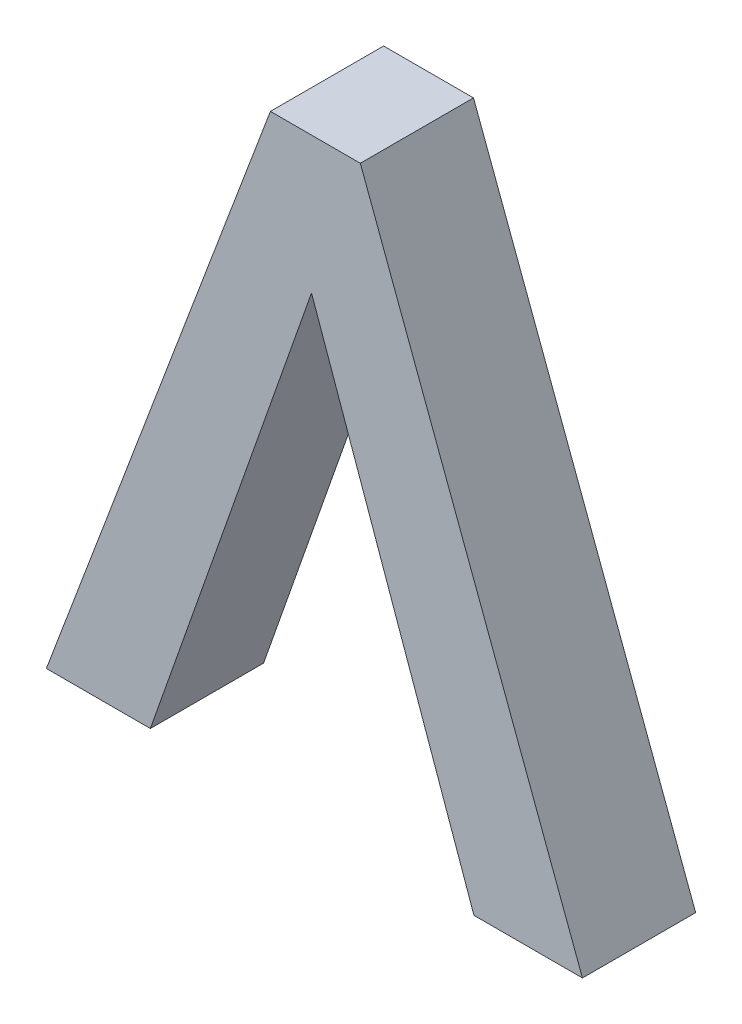
ISO-10303-21;
HEADER;
FILE_DESCRIPTION(('STEP AP214'),'2;1');
FILE_NAME('part.step','',(''),(''),'','','');
FILE_SCHEMA(('AUTOMOTIVE_DESIGN { 1 0 10303 214 1 1 1 1 }'));
ENDSEC;
DATA;
#1=APPLICATION_CONTEXT('core data for automotive mechanical design processes');
#2=APPLICATION_PROTOCOL_DEFINITION('international standard','automotive_design',2000,#1);
#3=PRODUCT_CONTEXT('',#1,'mechanical');
#4=PRODUCT('Part','Part','',(#3));
#5=PRODUCT_RELATED_PRODUCT_CATEGORY('part','',(#4));
#6=PRODUCT_DEFINITION_FORMATION('','',#4);
#7=PRODUCT_DEFINITION_CONTEXT('part definition',#1,'design');
#8=PRODUCT_DEFINITION('design','',#6,#7);
#9=PRODUCT_DEFINITION_SHAPE('','',#8);
#10=(LENGTH_UNIT() NAMED_UNIT(*) SI_UNIT(.MILLI.,.METRE.));
#11=(NAMED_UNIT(*) PLANE_ANGLE_UNIT() SI_UNIT($,.RADIAN.));
#12=(NAMED_UNIT(*) SI_UNIT($,.STERADIAN.) SOLID_ANGLE_UNIT());
#13=UNCERTAINTY_MEASURE_WITH_UNIT(LENGTH_MEASURE(1.E-05),#10,'distance_accuracy_value','');
#14=(GEOMETRIC_REPRESENTATION_CONTEXT(3) GLOBAL_UNCERTAINTY_ASSIGNED_CONTEXT((#13)) GLOBAL_UNIT_ASSIGNED_CONTEXT((#10,
#11,#12)) REPRESENTATION_CONTEXT('',''));
#15=CARTESIAN_POINT('',(0.,0.,0.));
#16=DIRECTION('',(0.,0.,1.));
#17=DIRECTION('',(1.,0.,0.));
#18=AXIS2_PLACEMENT_3D('',#15,#16,#17);
#19=CARTESIAN_POINT('',(-2.58061998201,1.28436413185,0.));
#20=DIRECTION('',(0.,1.,0.));
#21=DIRECTION('',(-1.,0.,0.));
#22=AXIS2_PLACEMENT_3D('',#19,#20,#21);
#23=PLANE('',#22);
#24=DIRECTION('',(1.,0.,0.));
#25=VECTOR('',#24,1.);
#26=CARTESIAN_POINT('',(-2.660018365691,1.28436413185,0.));
#27=LINE('',#26,#25);
#28=CARTESIAN_POINT('',(-2.660018365691,1.28436413185,0.));
#29=VERTEX_POINT('',#28);
#30=CARTESIAN_POINT('',(-2.58061998201,1.28436413185,0.));
#31=VERTEX_POINT('',#30);
#32=EDGE_CURVE('E11',#29,#31,#27,.T.);
#33=ORIENTED_EDGE('',*,*,#32,.F.);
#34=DIRECTION('',(0.,0.,1.));
#35=VECTOR('',#34,1.);
#36=CARTESIAN_POINT('',(-2.660018365691,1.28436413185,0.));
#37=LINE('',#36,#35);
#38=CARTESIAN_POINT('',(-2.660018365691,1.28436413185,0.1));
#39=VERTEX_POINT('',#38);
#40=EDGE_CURVE('E24',#29,#39,#37,.T.);
#41=ORIENTED_EDGE('',*,*,#40,.T.);
#42=DIRECTION('',(-1.,0.,0.));
#43=VECTOR('',#42,1.);
#44=CARTESIAN_POINT('',(-2.660018365691,1.28436413185,0.1));
#45=LINE('',#44,#43);
#46=CARTESIAN_POINT('',(-2.58061998201,1.28436413185,0.1));
#47=VERTEX_POINT('',#46);
#48=EDGE_CURVE('E94',#47,#39,#45,.T.);
#49=ORIENTED_EDGE('',*,*,#48,.F.);
#50=DIRECTION('',(0.,0.,1.));
#51=VECTOR('',#50,1.);
#52=CARTESIAN_POINT('',(-2.58061998201,1.28436413185,0.));
#53=LINE('',#52,#51);
#54=EDGE_CURVE('E127',#31,#47,#53,.T.);
#55=ORIENTED_EDGE('',*,*,#54,.F.);
#56=EDGE_LOOP('',(#33,#41,#49,#55));
#57=FACE_BOUND('',#56,.T.);
#58=ADVANCED_FACE('F17',(#57),#23,.T.);
#59=CARTESIAN_POINT('',(-2.384392548057,0.759200536932928,0.));
#60=DIRECTION('',(0.936744248481591,0.350014589605433,0.));
#61=DIRECTION('',(-0.350014589605433,0.936744248481591,0.));
#62=AXIS2_PLACEMENT_3D('',#59,#60,#61);
#63=PLANE('',#62);
#64=DIRECTION('',(0.350014589605433,-0.936744248481591,0.));
#65=VECTOR('',#64,1.);
#66=CARTESIAN_POINT('',(-2.58061998201,1.28436413185,0.));
#67=LINE('',#66,#65);
#68=CARTESIAN_POINT('',(-2.384392548057,0.759200536932928,0.));
#69=VERTEX_POINT('',#68);
#70=EDGE_CURVE('E125',#31,#69,#67,.T.);
#71=ORIENTED_EDGE('',*,*,#70,.F.);
#72=ORIENTED_EDGE('',*,*,#54,.T.);
#73=DIRECTION('',(-0.350014589605433,0.936744248481591,0.));
#74=VECTOR('',#73,1.);
#75=CARTESIAN_POINT('',(-2.58061998201,1.28436413185,0.1));
#76=LINE('',#75,#74);
#77=CARTESIAN_POINT('',(-2.384392548057,0.759200536932928,0.1));
#78=VERTEX_POINT('',#77);
#79=EDGE_CURVE('E123',#78,#47,#76,.T.);
#80=ORIENTED_EDGE('',*,*,#79,.F.);
#81=DIRECTION('',(0.,0.,1.));
#82=VECTOR('',#81,1.);
#83=CARTESIAN_POINT('',(-2.384392548057,0.759200536932928,0.));
#84=LINE('',#83,#82);
#85=EDGE_CURVE('E120',#69,#78,#84,.T.);
#86=ORIENTED_EDGE('',*,*,#85,.F.);
#87=EDGE_LOOP('',(#71,#72,#80,#86));
#88=FACE_BOUND('',#87,.T.);
#89=ADVANCED_FACE('F145',(#88),#63,.T.);
#90=CARTESIAN_POINT('',(-2.480237739785,0.759200536932928,0.));
#91=DIRECTION('',(0.,-1.,0.));
#92=DIRECTION('',(1.,0.,0.));
#93=AXIS2_PLACEMENT_3D('',#90,#91,#92);
#94=PLANE('',#93);
#95=DIRECTION('',(-1.,0.,0.));
#96=VECTOR('',#95,1.);
#97=CARTESIAN_POINT('',(-2.384392548057,0.759200536932928,0.));
#98=LINE('',#97,#96);
#99=CARTESIAN_POINT('',(-2.480237739785,0.759200536932928,0.));
#100=VERTEX_POINT('',#99);
#101=EDGE_CURVE('E118',#69,#100,#98,.T.);
#102=ORIENTED_EDGE('',*,*,#101,.F.);
#103=ORIENTED_EDGE('',*,*,#85,.T.);
#104=DIRECTION('',(1.,0.,0.));
#105=VECTOR('',#104,1.);
#106=CARTESIAN_POINT('',(-2.384392548057,0.759200536932928,0.1));
#107=LINE('',#106,#105);
#108=CARTESIAN_POINT('',(-2.480237739785,0.759200536932928,0.1));
#109=VERTEX_POINT('',#108);
#110=EDGE_CURVE('E115',#109,#78,#107,.T.);
#111=ORIENTED_EDGE('',*,*,#110,.F.);
#112=DIRECTION('',(0.,0.,1.));
#113=VECTOR('',#112,1.);
#114=CARTESIAN_POINT('',(-2.480237739785,0.759200536932928,0.));
#115=LINE('',#114,#113);
#116=EDGE_CURVE('E112',#100,#109,#115,.T.);
#117=ORIENTED_EDGE('',*,*,#116,.F.);
#118=EDGE_LOOP('',(#102,#103,#111,#117));
#119=FACE_BOUND('',#118,.T.);
#120=ADVANCED_FACE('F141',(#119),#94,.T.);
#121=CARTESIAN_POINT('',(-2.623721961723,1.163565162393,0.));
#122=DIRECTION('',(-0.942427745481246,-0.334409845170765,0.));
#123=DIRECTION('',(0.334409845170765,-0.942427745481246,0.));
#124=AXIS2_PLACEMENT_3D('',#121,#122,#123);
#125=PLANE('',#124);
#126=DIRECTION('',(-0.334409845170765,0.942427745481246,0.));
#127=VECTOR('',#126,1.);
#128=CARTESIAN_POINT('',(-2.480237739785,0.759200536932928,0.));
#129=LINE('',#128,#127);
#130=CARTESIAN_POINT('',(-2.623721961723,1.163565162393,0.));
#131=VERTEX_POINT('',#130);
#132=EDGE_CURVE('E110',#100,#131,#129,.T.);
#133=ORIENTED_EDGE('',*,*,#132,.F.);
#134=ORIENTED_EDGE('',*,*,#116,.T.);
#135=DIRECTION('',(0.334409845170765,-0.942427745481246,0.));
#136=VECTOR('',#135,1.);
#137=CARTESIAN_POINT('',(-2.480237739785,0.759200536932928,0.1));
#138=LINE('',#137,#136);
#139=CARTESIAN_POINT('',(-2.623721961723,1.163565162393,0.1));
#140=VERTEX_POINT('',#139);
#141=EDGE_CURVE('E107',#140,#109,#138,.T.);
#142=ORIENTED_EDGE('',*,*,#141,.F.);
#143=DIRECTION('',(0.,0.,1.));
#144=VECTOR('',#143,1.);
#145=CARTESIAN_POINT('',(-2.623721961723,1.163565162393,0.));
#146=LINE('',#145,#144);
#147=EDGE_CURVE('E104',#131,#140,#146,.T.);
#148=ORIENTED_EDGE('',*,*,#147,.F.);
#149=EDGE_LOOP('',(#133,#134,#142,#148));
#150=FACE_BOUND('',#149,.T.);
#151=ADVANCED_FACE('F137',(#150),#125,.T.);
#152=CARTESIAN_POINT('',(-2.766071921036,0.759200536932928,0.));
#153=DIRECTION('',(0.943258685640994,-0.332058807988623,0.));
#154=DIRECTION('',(0.332058807988623,0.943258685640994,0.));
#155=AXIS2_PLACEMENT_3D('',#152,#153,#154);
#156=PLANE('',#155);
#157=DIRECTION('',(-0.332058807988623,-0.943258685640994,0.));
#158=VECTOR('',#157,1.);
#159=CARTESIAN_POINT('',(-2.623721961723,1.163565162393,0.));
#160=LINE('',#159,#158);
#161=CARTESIAN_POINT('',(-2.766071921036,0.759200536932928,0.));
#162=VERTEX_POINT('',#161);
#163=EDGE_CURVE('E102',#131,#162,#160,.T.);
#164=ORIENTED_EDGE('',*,*,#163,.F.);
#165=ORIENTED_EDGE('',*,*,#147,.T.);
#166=DIRECTION('',(0.332058807988623,0.943258685640994,0.));
#167=VECTOR('',#166,1.);
#168=CARTESIAN_POINT('',(-2.623721961723,1.163565162393,0.1));
#169=LINE('',#168,#167);
#170=CARTESIAN_POINT('',(-2.766071921036,0.759200536932928,0.1));
#171=VERTEX_POINT('',#170);
#172=EDGE_CURVE('E100',#171,#140,#169,.T.);
#173=ORIENTED_EDGE('',*,*,#172,.F.);
#174=DIRECTION('',(0.,0.,1.));
#175=VECTOR('',#174,1.);
#176=CARTESIAN_POINT('',(-2.766071921036,0.759200536932928,0.));
#177=LINE('',#176,#175);
#178=EDGE_CURVE('E79',#162,#171,#177,.T.);
#179=ORIENTED_EDGE('',*,*,#178,.F.);
#180=EDGE_LOOP('',(#164,#165,#173,#179));
#181=FACE_BOUND('',#180,.T.);
#182=ADVANCED_FACE('F135',(#181),#156,.T.);
#183=CARTESIAN_POINT('',(-2.857947193581,0.759200536932928,0.));
#184=DIRECTION('',(0.,-1.,0.));
#185=DIRECTION('',(1.,0.,0.));
#186=AXIS2_PLACEMENT_3D('',#183,#184,#185);
#187=PLANE('',#186);
#188=DIRECTION('',(-1.,0.,0.));
#189=VECTOR('',#188,1.);
#190=CARTESIAN_POINT('',(-2.766071921036,0.759200536932928,0.));
#191=LINE('',#190,#189);
#192=CARTESIAN_POINT('',(-2.857947193581,0.759200536932928,0.));
#193=VERTEX_POINT('',#192);
#194=EDGE_CURVE('E83',#162,#193,#191,.T.);
#195=ORIENTED_EDGE('',*,*,#194,.F.);
#196=ORIENTED_EDGE('',*,*,#178,.T.);
#197=DIRECTION('',(1.,0.,0.));
#198=VECTOR('',#197,1.);
#199=CARTESIAN_POINT('',(-2.766071921036,0.759200536932928,0.1));
#200=LINE('',#199,#198);
#201=CARTESIAN_POINT('',(-2.857947193581,0.759200536932928,0.1));
#202=VERTEX_POINT('',#201);
#203=EDGE_CURVE('E72',#202,#171,#200,.T.);
#204=ORIENTED_EDGE('',*,*,#203,.F.);
#205=DIRECTION('',(0.,0.,1.));
#206=VECTOR('',#205,1.);
#207=CARTESIAN_POINT('',(-2.857947193581,0.759200536932928,0.));
#208=LINE('',#207,#206);
#209=EDGE_CURVE('E76',#193,#202,#208,.T.);
#210=ORIENTED_EDGE('',*,*,#209,.F.);
#211=EDGE_LOOP('',(#195,#196,#204,#210));
#212=FACE_BOUND('',#211,.T.);
#213=ADVANCED_FACE('F75',(#212),#187,.T.);
#214=CARTESIAN_POINT('',(-2.660018365691,1.28436413185,0.));
#215=DIRECTION('',(-0.935746495818411,0.35267335533545,0.));
#216=DIRECTION('',(-0.35267335533545,-0.935746495818411,0.));
#217=AXIS2_PLACEMENT_3D('',#214,#215,#216);
#218=PLANE('',#217);
#219=DIRECTION('',(0.35267335533545,0.935746495818411,0.));
#220=VECTOR('',#219,1.);
#221=CARTESIAN_POINT('',(-2.857947193581,0.759200536932928,0.));
#222=LINE('',#221,#220);
#223=EDGE_CURVE('E89',#193,#29,#222,.T.);
#224=ORIENTED_EDGE('',*,*,#223,.F.);
#225=ORIENTED_EDGE('',*,*,#209,.T.);
#226=DIRECTION('',(-0.35267335533545,-0.935746495818411,0.));
#227=VECTOR('',#226,1.);
#228=CARTESIAN_POINT('',(-2.857947193581,0.759200536932928,0.1));
#229=LINE('',#228,#227);
#230=EDGE_CURVE('E88',#39,#202,#229,.T.);
#231=ORIENTED_EDGE('',*,*,#230,.F.);
#232=ORIENTED_EDGE('',*,*,#40,.F.);
#233=EDGE_LOOP('',(#224,#225,#231,#232));
#234=FACE_BOUND('',#233,.T.);
#235=ADVANCED_FACE('F87',(#234),#218,.T.);
#236=CARTESIAN_POINT('',(-2.621565725245,0.986063050332372,0.));
#237=DIRECTION('',(0.,0.,1.));
#238=DIRECTION('',(1.,0.,0.));
#239=AXIS2_PLACEMENT_3D('',#236,#237,#238);
#240=PLANE('',#239);
#241=ORIENTED_EDGE('',*,*,#223,.T.);
#242=ORIENTED_EDGE('',*,*,#32,.T.);
#243=ORIENTED_EDGE('',*,*,#70,.T.);
#244=ORIENTED_EDGE('',*,*,#101,.T.);
#245=ORIENTED_EDGE('',*,*,#132,.T.);
#246=ORIENTED_EDGE('',*,*,#163,.T.);
#247=ORIENTED_EDGE('',*,*,#194,.T.);
#248=EDGE_LOOP('',(#241,#242,#243,#244,#245,#246,#247));
#249=FACE_BOUND('',#248,.T.);
#250=ADVANCED_FACE('F130',(#249),#240,.F.);
#251=CARTESIAN_POINT('',(-2.621565725245,0.986063050332372,0.1));
#252=DIRECTION('',(0.,0.,1.));
#253=DIRECTION('',(1.,0.,0.));
#254=AXIS2_PLACEMENT_3D('',#251,#252,#253);
#255=PLANE('',#254);
#256=ORIENTED_EDGE('',*,*,#230,.T.);
#257=ORIENTED_EDGE('',*,*,#203,.T.);
#258=ORIENTED_EDGE('',*,*,#172,.T.);
#259=ORIENTED_EDGE('',*,*,#141,.T.);
#260=ORIENTED_EDGE('',*,*,#110,.T.);
#261=ORIENTED_EDGE('',*,*,#79,.T.);
#262=ORIENTED_EDGE('',*,*,#48,.T.);
#263=EDGE_LOOP('',(#256,#257,#258,#259,#260,#261,#262));
#264=FACE_BOUND('',#263,.T.);
#265=ADVANCED_FACE('F92',(#264),#255,.T.);
#266=CLOSED_SHELL('',(#58,#89,#120,#151,#182,#213,#235,#250,#265));
#267=MANIFOLD_SOLID_BREP('B1',#266);
#268=ADVANCED_BREP_SHAPE_REPRESENTATION('',(#18,#267),#14);
#269=SHAPE_DEFINITION_REPRESENTATION(#9,#268);
ENDSEC;
END-ISO-10303-21;
